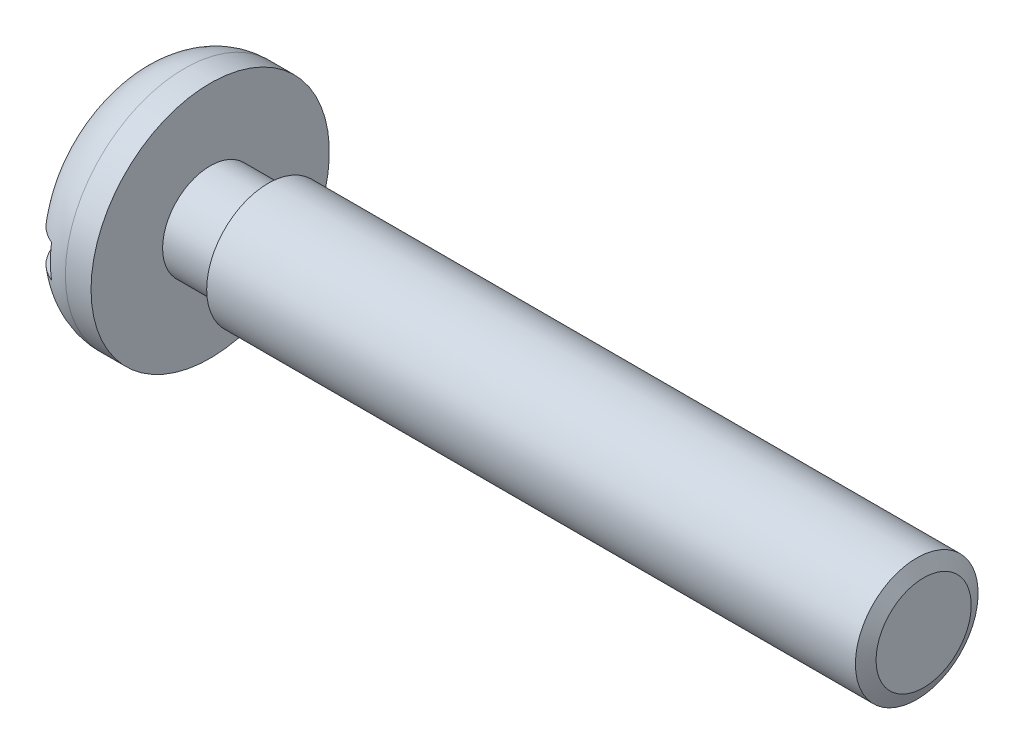
ISO-10303-21;
HEADER;
FILE_DESCRIPTION(('STEP AP214'),'2;1');
FILE_NAME('part.step','',(''),(''),'','','');
FILE_SCHEMA(('AUTOMOTIVE_DESIGN { 1 0 10303 214 1 1 1 1 }'));
ENDSEC;
DATA;
#1=APPLICATION_CONTEXT('core data for automotive mechanical design processes');
#2=APPLICATION_PROTOCOL_DEFINITION('international standard','automotive_design',2000,#1);
#3=PRODUCT_CONTEXT('',#1,'mechanical');
#4=PRODUCT('Part','Part','',(#3));
#5=PRODUCT_RELATED_PRODUCT_CATEGORY('part','',(#4));
#6=PRODUCT_DEFINITION_FORMATION('','',#4);
#7=PRODUCT_DEFINITION_CONTEXT('part definition',#1,'design');
#8=PRODUCT_DEFINITION('design','',#6,#7);
#9=PRODUCT_DEFINITION_SHAPE('','',#8);
#10=(LENGTH_UNIT() NAMED_UNIT(*) SI_UNIT(.MILLI.,.METRE.));
#11=(NAMED_UNIT(*) PLANE_ANGLE_UNIT() SI_UNIT($,.RADIAN.));
#12=(NAMED_UNIT(*) SI_UNIT($,.STERADIAN.) SOLID_ANGLE_UNIT());
#13=UNCERTAINTY_MEASURE_WITH_UNIT(LENGTH_MEASURE(1.E-05),#10,'distance_accuracy_value','');
#14=(GEOMETRIC_REPRESENTATION_CONTEXT(3) GLOBAL_UNCERTAINTY_ASSIGNED_CONTEXT((#13)) GLOBAL_UNIT_ASSIGNED_CONTEXT((#10,
#11,#12)) REPRESENTATION_CONTEXT('',''));
#15=CARTESIAN_POINT('',(0.,0.,0.));
#16=DIRECTION('',(0.,0.,1.));
#17=DIRECTION('',(1.,0.,0.));
#18=AXIS2_PLACEMENT_3D('',#15,#16,#17);
#19=CARTESIAN_POINT('',(-1.3462,1.2319,0.));
#20=DIRECTION('',(1.,0.,0.));
#21=DIRECTION('',(0.,0.,-1.));
#22=AXIS2_PLACEMENT_3D('',#19,#20,#21);
#23=PLANE('',#22);
#24=CARTESIAN_POINT('',(-1.3462,0.,0.));
#25=DIRECTION('',(-1.,0.,0.));
#26=DIRECTION('',(0.,0.,1.));
#27=AXIS2_PLACEMENT_3D('',#24,#25,#26);
#28=CIRCLE('',#27,1.2319);
#29=CARTESIAN_POINT('',(-1.3462,-0.2921,-1.196768649322));
#30=VERTEX_POINT('',#29);
#31=CARTESIAN_POINT('',(-1.3462,-0.2921,1.196768649322));
#32=VERTEX_POINT('',#31);
#33=EDGE_CURVE('E137',#30,#32,#28,.T.);
#34=ORIENTED_EDGE('',*,*,#33,.T.);
#35=DIRECTION('',(0.,0.,-1.));
#36=VECTOR('',#35,1.);
#37=CARTESIAN_POINT('',(-1.3462,-0.2921,0.));
#38=LINE('',#37,#36);
#39=EDGE_CURVE('E138',#32,#30,#38,.T.);
#40=ORIENTED_EDGE('',*,*,#39,.T.);
#41=EDGE_LOOP('',(#34,#40));
#42=FACE_BOUND('',#41,.T.);
#43=ADVANCED_FACE('F15',(#42),#23,.F.);
#44=CARTESIAN_POINT('',(-1.3462,0.2921,1.196768649322));
#45=VERTEX_POINT('',#44);
#46=CARTESIAN_POINT('',(-1.3462,0.2921,-1.196768649322));
#47=VERTEX_POINT('',#46);
#48=EDGE_CURVE('E82',#45,#47,#28,.T.);
#49=ORIENTED_EDGE('',*,*,#48,.T.);
#50=DIRECTION('',(0.,0.,1.));
#51=VECTOR('',#50,1.);
#52=CARTESIAN_POINT('',(-1.3462,0.2921,0.));
#53=LINE('',#52,#51);
#54=EDGE_CURVE('E76',#47,#45,#53,.T.);
#55=ORIENTED_EDGE('',*,*,#54,.T.);
#56=EDGE_LOOP('',(#49,#55));
#57=FACE_BOUND('',#56,.T.);
#58=ADVANCED_FACE('F17',(#57),#23,.F.);
#59=CARTESIAN_POINT('',(12.7,0.,0.));
#60=DIRECTION('',(-1.,0.,0.));
#61=DIRECTION('',(0.,0.,1.));
#62=AXIS2_PLACEMENT_3D('',#59,#60,#61);
#63=PLANE('',#62);
#64=CARTESIAN_POINT('',(12.7,0.,0.));
#65=DIRECTION('',(-1.,0.,0.));
#66=DIRECTION('',(0.,0.,1.));
#67=AXIS2_PLACEMENT_3D('',#64,#65,#66);
#68=CIRCLE('',#67,0.8471);
#69=CARTESIAN_POINT('',(12.7,0.,0.8471));
#70=VERTEX_POINT('',#69);
#71=EDGE_CURVE('E107',#70,#70,#68,.T.);
#72=ORIENTED_EDGE('',*,*,#71,.F.);
#73=EDGE_LOOP('',(#72));
#74=FACE_BOUND('',#73,.T.);
#75=ADVANCED_FACE('F248',(#74),#63,.F.);
#76=CARTESIAN_POINT('',(12.7,0.,0.));
#77=DIRECTION('',(-1.,0.,0.));
#78=DIRECTION('',(0.,0.,1.));
#79=AXIS2_PLACEMENT_3D('',#76,#77,#78);
#80=CONICAL_SURFACE('',#79,0.8471,1.10714871779409);
#81=CARTESIAN_POINT('',(12.57745,0.,0.));
#82=DIRECTION('',(-1.,0.,0.));
#83=DIRECTION('',(0.,0.,1.));
#84=AXIS2_PLACEMENT_3D('',#81,#82,#83);
#85=CIRCLE('',#84,1.0922);
#86=CARTESIAN_POINT('',(12.57745,0.,1.0922));
#87=VERTEX_POINT('',#86);
#88=EDGE_CURVE('E111',#87,#87,#85,.T.);
#89=ORIENTED_EDGE('',*,*,#88,.F.);
#90=EDGE_LOOP('',(#89));
#91=FACE_BOUND('',#90,.T.);
#92=ORIENTED_EDGE('',*,*,#71,.T.);
#93=EDGE_LOOP('',(#92));
#94=FACE_BOUND('',#93,.T.);
#95=ADVANCED_FACE('F237',(#91,#94),#80,.T.);
#96=CARTESIAN_POINT('',(-1.3462,0.,0.));
#97=DIRECTION('',(-1.,0.,0.));
#98=DIRECTION('',(0.,0.,1.));
#99=AXIS2_PLACEMENT_3D('',#96,#97,#98);
#100=CYLINDRICAL_SURFACE('',#99,1.0922);
#101=CARTESIAN_POINT('',(1.02969285714286,0.,0.));
#102=DIRECTION('',(-1.,0.,0.));
#103=DIRECTION('',(0.,0.,1.));
#104=AXIS2_PLACEMENT_3D('',#101,#102,#103);
#105=CIRCLE('',#104,1.0922);
#106=CARTESIAN_POINT('',(1.02969285714286,0.,1.0922));
#107=VERTEX_POINT('',#106);
#108=EDGE_CURVE('E115',#107,#107,#105,.T.);
#109=ORIENTED_EDGE('',*,*,#108,.F.);
#110=EDGE_LOOP('',(#109));
#111=FACE_BOUND('',#110,.T.);
#112=ORIENTED_EDGE('',*,*,#88,.T.);
#113=EDGE_LOOP('',(#112));
#114=FACE_BOUND('',#113,.T.);
#115=ADVANCED_FACE('F226',(#111,#114),#100,.T.);
#116=CARTESIAN_POINT('',(1.02969285714286,0.,0.));
#117=DIRECTION('',(1.,0.,0.));
#118=DIRECTION('',(0.,0.,-1.));
#119=AXIS2_PLACEMENT_3D('',#116,#117,#118);
#120=CONICAL_SURFACE('',#119,1.0922,1.10714871779409);
#121=CARTESIAN_POINT('',(0.907142857142857,0.,0.));
#122=DIRECTION('',(-1.,0.,0.));
#123=DIRECTION('',(0.,0.,1.));
#124=AXIS2_PLACEMENT_3D('',#121,#122,#123);
#125=CIRCLE('',#124,0.8471);
#126=CARTESIAN_POINT('',(0.907142857142857,0.,0.8471));
#127=VERTEX_POINT('',#126);
#128=EDGE_CURVE('E119',#127,#127,#125,.T.);
#129=ORIENTED_EDGE('',*,*,#128,.F.);
#130=EDGE_LOOP('',(#129));
#131=FACE_BOUND('',#130,.T.);
#132=ORIENTED_EDGE('',*,*,#108,.T.);
#133=EDGE_LOOP('',(#132));
#134=FACE_BOUND('',#133,.T.);
#135=ADVANCED_FACE('F215',(#131,#134),#120,.T.);
#136=CARTESIAN_POINT('',(-1.3462,0.,0.));
#137=DIRECTION('',(-1.,0.,0.));
#138=DIRECTION('',(0.,0.,1.));
#139=AXIS2_PLACEMENT_3D('',#136,#137,#138);
#140=CYLINDRICAL_SURFACE('',#139,0.8471);
#141=CARTESIAN_POINT('',(0.,0.,0.));
#142=DIRECTION('',(-1.,0.,0.));
#143=DIRECTION('',(0.,0.,1.));
#144=AXIS2_PLACEMENT_3D('',#141,#142,#143);
#145=CIRCLE('',#144,0.8471);
#146=CARTESIAN_POINT('',(0.,0.,0.8471));
#147=VERTEX_POINT('',#146);
#148=EDGE_CURVE('E123',#147,#147,#145,.T.);
#149=ORIENTED_EDGE('',*,*,#148,.F.);
#150=EDGE_LOOP('',(#149));
#151=FACE_BOUND('',#150,.T.);
#152=ORIENTED_EDGE('',*,*,#128,.T.);
#153=EDGE_LOOP('',(#152));
#154=FACE_BOUND('',#153,.T.);
#155=ADVANCED_FACE('F204',(#151,#154),#140,.T.);
#156=CARTESIAN_POINT('',(0.,0.8471,0.));
#157=DIRECTION('',(-1.,0.,0.));
#158=DIRECTION('',(0.,0.,1.));
#159=AXIS2_PLACEMENT_3D('',#156,#157,#158);
#160=PLANE('',#159);
#161=CARTESIAN_POINT('',(0.,0.,0.));
#162=DIRECTION('',(-1.,0.,0.));
#163=DIRECTION('',(0.,0.,1.));
#164=AXIS2_PLACEMENT_3D('',#161,#162,#163);
#165=CIRCLE('',#164,2.1209);
#166=CARTESIAN_POINT('',(0.,0.,2.1209));
#167=VERTEX_POINT('',#166);
#168=EDGE_CURVE('E127',#167,#167,#165,.T.);
#169=ORIENTED_EDGE('',*,*,#168,.F.);
#170=EDGE_LOOP('',(#169));
#171=FACE_BOUND('',#170,.T.);
#172=ORIENTED_EDGE('',*,*,#148,.T.);
#173=EDGE_LOOP('',(#172));
#174=FACE_BOUND('',#173,.T.);
#175=ADVANCED_FACE('F194',(#171,#174),#160,.F.);
#176=CARTESIAN_POINT('',(-1.3462,0.,0.));
#177=DIRECTION('',(-1.,0.,0.));
#178=DIRECTION('',(0.,0.,1.));
#179=AXIS2_PLACEMENT_3D('',#176,#177,#178);
#180=CYLINDRICAL_SURFACE('',#179,2.1209);
#181=CARTESIAN_POINT('',(-0.4572,0.,0.));
#182=DIRECTION('',(-1.,0.,0.));
#183=DIRECTION('',(0.,0.,1.));
#184=AXIS2_PLACEMENT_3D('',#181,#182,#183);
#185=CIRCLE('',#184,2.1209);
#186=CARTESIAN_POINT('',(-0.4572,0.,2.1209));
#187=VERTEX_POINT('',#186);
#188=EDGE_CURVE('E131',#187,#187,#185,.T.);
#189=ORIENTED_EDGE('',*,*,#188,.F.);
#190=EDGE_LOOP('',(#189));
#191=FACE_BOUND('',#190,.T.);
#192=ORIENTED_EDGE('',*,*,#168,.T.);
#193=EDGE_LOOP('',(#192));
#194=FACE_BOUND('',#193,.T.);
#195=ADVANCED_FACE('F185',(#191,#194),#180,.T.);
#196=CARTESIAN_POINT('',(-0.4572,0.,0.));
#197=DIRECTION('',(-1.,0.,0.));
#198=DIRECTION('',(0.,0.,1.));
#199=AXIS2_PLACEMENT_3D('',#196,#197,#198);
#200=TOROIDAL_SURFACE('',#199,1.2319,0.889);
#201=CARTESIAN_POINT('',(-0.7874,0.,0.));
#202=DIRECTION('',(1.,0.,0.));
#203=DIRECTION('',(0.,0.,-1.));
#204=AXIS2_PLACEMENT_3D('',#201,#202,#203);
#205=CIRCLE('',#204,2.05730230191102);
#206=CARTESIAN_POINT('',(-0.7874,0.2921,2.03646025039733));
#207=VERTEX_POINT('',#206);
#208=CARTESIAN_POINT('',(-0.7874,-0.2921,2.03646025039733));
#209=VERTEX_POINT('',#208);
#210=EDGE_CURVE('E61',#207,#209,#205,.T.);
#211=ORIENTED_EDGE('',*,*,#210,.T.);
#212=CARTESIAN_POINT('',(-0.992672438637413,-0.2921,0.432934305643319));
#213=CARTESIAN_POINT('',(-0.951976302403638,-0.2921,0.395882314610575));
#214=CARTESIAN_POINT('',(-0.908727308114687,-0.2921,0.361624142766205));
#215=CARTESIAN_POINT('',(-0.840630830973308,-0.2921,0.314956422780139));
#216=CARTESIAN_POINT('',(-0.817376844307591,-0.2921,0.300178124351799));
#217=CARTESIAN_POINT('',(-0.769830336334795,-0.2921,0.272408816585435));
#218=CARTESIAN_POINT('',(-0.745538319363267,-0.2921,0.259416951949301));
#219=CARTESIAN_POINT('',(-0.691476053082714,-0.2921,0.233453302492282));
#220=CARTESIAN_POINT('',(-0.661501470432795,-0.2921,0.22089837012876));
#221=CARTESIAN_POINT('',(-0.600181210266825,-0.2921,0.200024753087824));
#222=CARTESIAN_POINT('',(-0.568842288590604,-0.2921,0.191687312499439));
#223=CARTESIAN_POINT('',(-0.509599457312778,-0.2921,0.181785972508896));
#224=CARTESIAN_POINT('',(-0.481836724849506,-0.2921,0.179430749928932));
#225=CARTESIAN_POINT('',(-0.426342853074537,-0.2921,0.179800268752367));
#226=CARTESIAN_POINT('',(-0.398611722176877,-0.2921,0.182526141735702));
#227=CARTESIAN_POINT('',(-0.334096578427921,-0.2921,0.194097869512075));
#228=CARTESIAN_POINT('',(-0.297666095143047,-0.2921,0.20480069646197));
#229=CARTESIAN_POINT('',(-0.226665266455918,-0.2921,0.231455710401772));
#230=CARTESIAN_POINT('',(-0.192108063254158,-0.2921,0.247440493728884));
#231=CARTESIAN_POINT('',(-0.129893014009047,-0.2921,0.280465132785374));
#232=CARTESIAN_POINT('',(-0.101966495091048,-0.2921,0.297006626603626));
#233=CARTESIAN_POINT('',(-0.0475848363779582,-0.2921,0.332362694096872));
#234=CARTESIAN_POINT('',(-0.021130508844512,-0.2921,0.351178504787953));
#235=CARTESIAN_POINT('',(0.0557498887027582,-0.2921,0.410647327942976));
#236=CARTESIAN_POINT('',(0.103837699645755,-0.2921,0.45440039799162));
#237=CARTESIAN_POINT('',(0.19267941328707,-0.2921,0.54994205808474));
#238=CARTESIAN_POINT('',(0.233325092281033,-0.2921,0.601831512275902));
#239=CARTESIAN_POINT('',(0.30452091587593,-0.2921,0.712152698523906));
#240=CARTESIAN_POINT('',(0.335078076750835,-0.2921,0.770579845778615));
#241=CARTESIAN_POINT('',(0.382651320036513,-0.2921,0.888038597832505));
#242=CARTESIAN_POINT('',(0.400457200702972,-0.2921,0.946749442702547));
#243=CARTESIAN_POINT('',(0.424745459936411,-0.2921,1.06648802241002));
#244=CARTESIAN_POINT('',(0.431231788575531,-0.2921,1.12751494143121));
#245=CARTESIAN_POINT('',(0.432243697825684,-0.2921,1.24352816725672));
#246=CARTESIAN_POINT('',(0.427904016121639,-0.2921,1.29850622045822));
#247=CARTESIAN_POINT('',(0.409535255455774,-0.2921,1.40681520034198));
#248=CARTESIAN_POINT('',(0.395510450915781,-0.2921,1.46014684280614));
#249=CARTESIAN_POINT('',(0.359061437997411,-0.2921,1.56072841183747));
#250=CARTESIAN_POINT('',(0.337110558223342,-0.2921,1.60815030380737));
#251=CARTESIAN_POINT('',(0.285352482255086,-0.2921,1.69849554453694));
#252=CARTESIAN_POINT('',(0.255546454905018,-0.2921,1.74141956125242));
#253=CARTESIAN_POINT('',(0.189795813324276,-0.2921,1.82038320852261));
#254=CARTESIAN_POINT('',(0.154031761032469,-0.2921,1.85657330582249));
#255=CARTESIAN_POINT('',(0.0768609189134639,-0.2921,1.92233195432511));
#256=CARTESIAN_POINT('',(0.0354546294751286,-0.2921,1.95190109210192));
#257=CARTESIAN_POINT('',(-0.051199372290232,-0.2921,2.00316417171778));
#258=CARTESIAN_POINT('',(-0.0963859756334818,-0.2921,2.02496146011344));
#259=CARTESIAN_POINT('',(-0.189794863444509,-0.2921,2.06059947774309));
#260=CARTESIAN_POINT('',(-0.238017013247673,-0.2921,2.07444055965917));
#261=CARTESIAN_POINT('',(-0.335764668045911,-0.2921,2.09368641852875));
#262=CARTESIAN_POINT('',(-0.385278691349902,-0.2921,2.09914955190282));
#263=CARTESIAN_POINT('',(-0.484519453606647,-0.2921,2.10166360796056));
#264=CARTESIAN_POINT('',(-0.534246188283067,-0.2921,2.09871469897306));
#265=CARTESIAN_POINT('',(-0.632375738931346,-0.2921,2.0845089698509));
#266=CARTESIAN_POINT('',(-0.680781443517738,-0.2921,2.07327208755944));
#267=CARTESIAN_POINT('',(-0.77502314738635,-0.2921,2.04284266210274));
#268=CARTESIAN_POINT('',(-0.820859151169377,-0.2921,2.02365013287223));
#269=CARTESIAN_POINT('',(-0.908739661466676,-0.2921,1.97783533101026));
#270=CARTESIAN_POINT('',(-0.950778430758976,-0.2921,1.9512020567031));
#271=CARTESIAN_POINT('',(-1.02981938083941,-0.2921,1.89129319939671));
#272=CARTESIAN_POINT('',(-1.06682148964855,-0.2921,1.85801752148754));
#273=CARTESIAN_POINT('',(-1.13497797888147,-0.2921,1.78557604040786));
#274=CARTESIAN_POINT('',(-1.16609763403501,-0.2921,1.74637757680937));
#275=CARTESIAN_POINT('',(-1.22139984472465,-0.2921,1.66336245659058));
#276=CARTESIAN_POINT('',(-1.2455821264248,-0.2921,1.61954561776446));
#277=CARTESIAN_POINT('',(-1.28664519432551,-0.2921,1.52800704096665));
#278=CARTESIAN_POINT('',(-1.30343834606938,-0.2921,1.48024601864444));
#279=CARTESIAN_POINT('',(-1.32894363580326,-0.2921,1.38261880771803));
#280=CARTESIAN_POINT('',(-1.33765541348183,-0.2921,1.33275252535354));
#281=CARTESIAN_POINT('',(-1.34698928328245,-0.2921,1.23122253976434));
#282=CARTESIAN_POINT('',(-1.34743873377999,-0.2921,1.17954304448759));
#283=CARTESIAN_POINT('',(-1.33997550050584,-0.2921,1.0767962437406));
#284=CARTESIAN_POINT('',(-1.33206131228534,-0.2921,1.02572905008238));
#285=CARTESIAN_POINT('',(-1.30785496246849,-0.2921,0.923599249518503));
#286=CARTESIAN_POINT('',(-1.29125928355239,-0.2921,0.872608860886494));
#287=CARTESIAN_POINT('',(-1.25027871991642,-0.2921,0.773888674672268));
#288=CARTESIAN_POINT('',(-1.22589419258904,-0.2921,0.726158727606152));
#289=CARTESIAN_POINT('',(-1.17009543264154,-0.2921,0.634594296147874));
#290=CARTESIAN_POINT('',(-1.13863614956343,-0.2921,0.590787409837325));
#291=CARTESIAN_POINT('',(-1.06982489913658,-0.2921,0.508072521804637));
#292=CARTESIAN_POINT('',(-1.03246931055133,-0.2921,0.469167557193672));
#293=CARTESIAN_POINT('',(-0.992672438637413,-0.2921,0.432934305643319));
#294=B_SPLINE_CURVE_WITH_KNOTS('',3,(#212,#213,#214,#215,#216,#217,#218,#219,#220,#221,#222,
#223,#224,#225,#226,#227,#228,#229,#230,#231,#232,#233,#234,#235,#236,#237,#238,#239,#240,#241,
#242,#243,#244,#245,#246,#247,#248,#249,#250,#251,#252,#253,#254,#255,#256,#257,#258,#259,#260,
#261,#262,#263,#264,#265,#266,#267,#268,#269,#270,#271,#272,#273,#274,#275,#276,#277,#278,#279,
#280,#281,#282,#283,#284,#285,#286,#287,#288,#289,#290,#291,#292,#293),.UNSPECIFIED.,.T.,.F.,(4,
2,2,2,2,2,2,2,2,2,2,2,2,2,2,2,2,2,2,2,2,2,2,2,2,2,2,2,2,2,2,2,2,2,2,2,2,2,2,2,4),(0.,
0.16495775981017,0.24755626720245,0.330115089844927,0.427398573052825,0.524245530215674,
0.60739299954584,0.69055898835636,0.803805959361426,0.91776528282531,1.01501518531125,
1.11231822271878,1.30643675482596,1.50318604715208,1.69979821634306,1.88282418140949,
2.06578626493389,2.23039162657576,2.39492438785135,2.55092420669776,2.70690082590108,
2.8588056311825,3.01069697335346,3.16048575872783,3.31026790376476,3.45900192815745,
3.60773297633499,3.75610739400144,3.90448155178353,4.05307626315311,4.20167309786912,
4.3511214611586,4.50057572274764,4.65175763003305,4.80294627750292,4.95729050769183,
5.11166250600081,5.27183282781698,5.43199580124925,5.59320908443223,5.75452176533789),.UNSPECIFIED.);
#295=EDGE_CURVE('E10',#209,#32,#294,.T.);
#296=ORIENTED_EDGE('',*,*,#295,.T.);
#297=ORIENTED_EDGE('',*,*,#33,.F.);
#298=CARTESIAN_POINT('',(-1.06697298726154,-0.2921,-1.85596879314736));
#299=CARTESIAN_POINT('',(-1.03098548144302,-0.2921,-1.89030721062701));
#300=CARTESIAN_POINT('',(-0.992107884086906,-0.2921,-1.9216253737167));
#301=CARTESIAN_POINT('',(-0.909644399354977,-0.2921,-1.97730508815571));
#302=CARTESIAN_POINT('',(-0.866057577568001,-0.2921,-2.00166525538257));
#303=CARTESIAN_POINT('',(-0.775399479777941,-0.2921,-2.04271054069887));
#304=CARTESIAN_POINT('',(-0.728327719279927,-0.2921,-2.05939458927808));
#305=CARTESIAN_POINT('',(-0.632046826721519,-0.2921,-2.08458876370733));
#306=CARTESIAN_POINT('',(-0.582837789836314,-0.2921,-2.09309925314537));
#307=CARTESIAN_POINT('',(-0.483872766325003,-0.2921,-2.10168005939517));
#308=CARTESIAN_POINT('',(-0.43411946886111,-0.2921,-2.10178141268704));
#309=CARTESIAN_POINT('',(-0.335304317498453,-0.2921,-2.09361914516227));
#310=CARTESIAN_POINT('',(-0.286242456640679,-0.2921,-2.08535560859567));
#311=CARTESIAN_POINT('',(-0.190258784568471,-0.2921,-2.06072057304478));
#312=CARTESIAN_POINT('',(-0.143334606238082,-0.2921,-2.04435829270059));
#313=CARTESIAN_POINT('',(-0.0528890535515041,-0.2921,-2.00400875494042));
#314=CARTESIAN_POINT('',(-0.00936769366654838,-0.2921,-1.98002146509961));
#315=CARTESIAN_POINT('',(0.0731727925832212,-0.2921,-1.9250437981044));
#316=CARTESIAN_POINT('',(0.112179208450556,-0.2921,-1.89403434353768));
#317=CARTESIAN_POINT('',(0.184477690524985,-0.2921,-1.82595030639236));
#318=CARTESIAN_POINT('',(0.217769648109022,-0.2921,-1.78887560854899));
#319=CARTESIAN_POINT('',(0.277970868440114,-0.2921,-1.70943388883647));
#320=CARTESIAN_POINT('',(0.304831471891644,-0.2921,-1.66703000719749));
#321=CARTESIAN_POINT('',(0.351162133369711,-0.2921,-1.57836386916823));
#322=CARTESIAN_POINT('',(0.37063182752706,-0.2921,-1.53210142294986));
#323=CARTESIAN_POINT('',(0.401948275669985,-0.2921,-1.43634785180313));
#324=CARTESIAN_POINT('',(0.413684268389264,-0.2921,-1.38682053982095));
#325=CARTESIAN_POINT('',(0.428889824774922,-0.2921,-1.28651981559142));
#326=CARTESIAN_POINT('',(0.432358956784081,-0.2921,-1.23574633841493));
#327=CARTESIAN_POINT('',(0.431078862405955,-0.2921,-1.13303224849355));
#328=CARTESIAN_POINT('',(0.426121042227419,-0.2921,-1.08109434943144));
#329=CARTESIAN_POINT('',(0.407936632360012,-0.2921,-0.978693150561658));
#330=CARTESIAN_POINT('',(0.394708332033858,-0.2921,-0.928230158079346));
#331=CARTESIAN_POINT('',(0.359808634821553,-0.2921,-0.827747809325714));
#332=CARTESIAN_POINT('',(0.337781453922837,-0.2921,-0.777852421282294));
#333=CARTESIAN_POINT('',(0.286279522453327,-0.2921,-0.682098190054024));
#334=CARTESIAN_POINT('',(0.256804592194011,-0.2921,-0.636239444295439));
#335=CARTESIAN_POINT('',(0.188793411919309,-0.2921,-0.545776261529059));
#336=CARTESIAN_POINT('',(0.149712472283708,-0.2921,-0.50158272253969));
#337=CARTESIAN_POINT('',(0.0654029337913393,-0.2921,-0.41943681508496));
#338=CARTESIAN_POINT('',(0.0201666005199633,-0.2921,-0.38149243359891));
#339=CARTESIAN_POINT('',(-0.0655144480877994,-0.2921,-0.319656520268563));
#340=CARTESIAN_POINT('',(-0.105030774172858,-0.2921,-0.294479834363365));
#341=CARTESIAN_POINT('',(-0.166517885754436,-0.2921,-0.260777339308461));
#342=CARTESIAN_POINT('',(-0.187380638483858,-0.2921,-0.250220931364947));
#343=CARTESIAN_POINT('',(-0.22985543169453,-0.2921,-0.230757236114179));
#344=CARTESIAN_POINT('',(-0.251467077599952,-0.2921,-0.221849095595576));
#345=CARTESIAN_POINT('',(-0.30141375983301,-0.2921,-0.203993981505409));
#346=CARTESIAN_POINT('',(-0.329988040695985,-0.2921,-0.195686487556193));
#347=CARTESIAN_POINT('',(-0.388020025038903,-0.2921,-0.183882848722512));
#348=CARTESIAN_POINT('',(-0.417471947697693,-0.2921,-0.180360265915577));
#349=CARTESIAN_POINT('',(-0.476684100732781,-0.2921,-0.179069970047914));
#350=CARTESIAN_POINT('',(-0.506445129601433,-0.2921,-0.181335562051191));
#351=CARTESIAN_POINT('',(-0.565212057501611,-0.2921,-0.191005491205652));
#352=CARTESIAN_POINT('',(-0.594213100956741,-0.2921,-0.198437083159847));
#353=CARTESIAN_POINT('',(-0.645881942505189,-0.2921,-0.215317364373907));
#354=CARTESIAN_POINT('',(-0.668755620572376,-0.2921,-0.224168557723448));
#355=CARTESIAN_POINT('',(-0.713679278072415,-0.2921,-0.243778326687423));
#356=CARTESIAN_POINT('',(-0.735728656526258,-0.2921,-0.254538262309401));
#357=CARTESIAN_POINT('',(-0.800727778021493,-0.2921,-0.289148454517574));
#358=CARTESIAN_POINT('',(-0.842453164995195,-0.2921,-0.315301690704514));
#359=CARTESIAN_POINT('',(-0.936436817387702,-0.2921,-0.382491279483391));
#360=CARTESIAN_POINT('',(-0.987265338494482,-0.2921,-0.425532053164752));
#361=CARTESIAN_POINT('',(-1.08091844661583,-0.2921,-0.519471660579893));
#362=CARTESIAN_POINT('',(-1.12375749870863,-0.2921,-0.570355982126777));
#363=CARTESIAN_POINT('',(-1.1993519535428,-0.2921,-0.678768612122051));
#364=CARTESIAN_POINT('',(-1.23216234462503,-0.2921,-0.736258221148343));
#365=CARTESIAN_POINT('',(-1.2861633281036,-0.2921,-0.856512120051585));
#366=CARTESIAN_POINT('',(-1.30735531410856,-0.2921,-0.919275776273221));
#367=CARTESIAN_POINT('',(-1.33494887975992,-0.2921,-1.04014019393372));
#368=CARTESIAN_POINT('',(-1.3428076709284,-0.2921,-1.09790993294163));
#369=CARTESIAN_POINT('',(-1.34782264907081,-0.2921,-1.21390959589146));
#370=CARTESIAN_POINT('',(-1.34498520279187,-0.2921,-1.27213922549821));
#371=CARTESIAN_POINT('',(-1.3291314528051,-0.2921,-1.38250251927555));
#372=CARTESIAN_POINT('',(-1.31693458217976,-0.2921,-1.43475505322979));
#373=CARTESIAN_POINT('',(-1.28358835438538,-0.2921,-1.53631137202184));
#374=CARTESIAN_POINT('',(-1.26244379484754,-0.2921,-1.58561672095573));
#375=CARTESIAN_POINT('',(-1.21483378384803,-0.2921,-1.67403025523813));
#376=CARTESIAN_POINT('',(-1.18931514441613,-0.2921,-1.71365149524175));
#377=CARTESIAN_POINT('',(-1.13238106226083,-0.2921,-1.78840264887311));
#378=CARTESIAN_POINT('',(-1.10096636246282,-0.2921,-1.82353312741687));
#379=CARTESIAN_POINT('',(-1.06697298726154,-0.2921,-1.85596879314736));
#380=B_SPLINE_CURVE_WITH_KNOTS('',3,(#298,#299,#300,#301,#302,#303,#304,#305,#306,#307,#308,
#309,#310,#311,#312,#313,#314,#315,#316,#317,#318,#319,#320,#321,#322,#323,#324,#325,#326,#327,
#328,#329,#330,#331,#332,#333,#334,#335,#336,#337,#338,#339,#340,#341,#342,#343,#344,#345,#346,
#347,#348,#349,#350,#351,#352,#353,#354,#355,#356,#357,#358,#359,#360,#361,#362,#363,#364,#365,
#366,#367,#368,#369,#370,#371,#372,#373,#374,#375,#376,#377,#378,#379),.UNSPECIFIED.,.T.,.F.,(4,
2,2,2,2,2,2,2,2,2,2,2,2,2,2,2,2,2,2,2,2,2,2,2,2,2,2,2,2,2,2,2,2,2,2,2,2,2,2,2,4),(0.,
0.14905902386792,0.298147678751285,0.447257099805331,0.596359887652682,0.744912341640851,
0.89346329944394,1.04184555215146,1.19022843585283,1.33901937952592,1.48781315117269,
1.63769943053109,1.78759308813289,1.93958936812845,2.09159358449268,2.24741541426667,
2.40326948435204,2.56619358506477,2.72912161694988,2.90540399980085,3.08190996752683,
3.22210912823777,3.2921977247132,3.36224993830917,3.451224485425,3.53970539675627,
3.62869657101617,3.71816084426597,3.79164316554849,3.86517805593972,4.01248592577054,
4.21139011458747,4.40993061153603,4.60736210675416,4.80476991520433,4.97874179997717,
5.15261014740244,5.31278224788245,5.47286857482533,5.61368570915038,5.75448511189392),.UNSPECIFIED.);
#381=CARTESIAN_POINT('',(-0.7874,-0.2921,-2.03646025039733));
#382=VERTEX_POINT('',#381);
#383=EDGE_CURVE('E43',#30,#382,#380,.T.);
#384=ORIENTED_EDGE('',*,*,#383,.T.);
#385=CARTESIAN_POINT('',(-0.7874,0.2921,-2.03646025039733));
#386=VERTEX_POINT('',#385);
#387=EDGE_CURVE('E68',#382,#386,#205,.T.);
#388=ORIENTED_EDGE('',*,*,#387,.T.);
#389=CARTESIAN_POINT('',(-1.06697298726154,0.2921,-1.85596879314736));
#390=CARTESIAN_POINT('',(-1.10354708191385,0.2921,-1.8210667472002));
#391=CARTESIAN_POINT('',(-1.13716869677334,0.2921,-1.78301322630452));
#392=CARTESIAN_POINT('',(-1.19753583165128,0.2921,-1.70174544545054));
#393=CARTESIAN_POINT('',(-1.22427214476066,0.2921,-1.65852438740261));
#394=CARTESIAN_POINT('',(-1.27010367740325,0.2921,-1.56826934336279));
#395=CARTESIAN_POINT('',(-1.28920801116125,0.2921,-1.52123998654877));
#396=CARTESIAN_POINT('',(-1.31936631369945,0.2921,-1.42469028143375));
#397=CARTESIAN_POINT('',(-1.33042258060802,0.2921,-1.37517064855333));
#398=CARTESIAN_POINT('',(-1.3444171370963,0.2921,-1.27425757644573));
#399=CARTESIAN_POINT('',(-1.34723340776844,0.2921,-1.22284727839722));
#400=CARTESIAN_POINT('',(-1.34449205791633,0.2921,-1.12025065901046));
#401=CARTESIAN_POINT('',(-1.3389323687076,0.2921,-1.06906439613576));
#402=CARTESIAN_POINT('',(-1.31946016188711,0.2921,-0.966473499845394));
#403=CARTESIAN_POINT('',(-1.30526492171769,0.2921,-0.915122743630748));
#404=CARTESIAN_POINT('',(-1.2689597835808,0.2921,-0.815335009058525));
#405=CARTESIAN_POINT('',(-1.24685117327621,0.2921,-0.766897558145079));
#406=CARTESIAN_POINT('',(-1.1939911224401,0.2921,-0.67101952646385));
#407=CARTESIAN_POINT('',(-1.16278700313543,0.2921,-0.623829098727242));
#408=CARTESIAN_POINT('',(-1.09360263837529,0.2921,-0.534667399266872));
#409=CARTESIAN_POINT('',(-1.05561334737469,0.2921,-0.492703223174028));
#410=CARTESIAN_POINT('',(-0.969581240619593,0.2921,-0.410267090352194));
#411=CARTESIAN_POINT('',(-0.920892646937336,0.2921,-0.370464284514564));
#412=CARTESIAN_POINT('',(-0.843677993687896,0.2921,-0.316835843256897));
#413=CARTESIAN_POINT('',(-0.817219651673264,0.2921,-0.299961108071455));
#414=CARTESIAN_POINT('',(-0.762963103697467,0.2921,-0.268540844362752));
#415=CARTESIAN_POINT('',(-0.735165994716016,0.2921,-0.253993449692668));
#416=CARTESIAN_POINT('',(-0.677570247336987,0.2921,-0.227522190381186));
#417=CARTESIAN_POINT('',(-0.647740831184659,0.2921,-0.215663922683793));
#418=CARTESIAN_POINT('',(-0.586816178107002,0.2921,-0.196329123679199));
#419=CARTESIAN_POINT('',(-0.555729797897136,0.2921,-0.188826239385564));
#420=CARTESIAN_POINT('',(-0.492099654757595,0.2921,-0.179866088840567));
#421=CARTESIAN_POINT('',(-0.459540534988772,0.2921,-0.178507430150808));
#422=CARTESIAN_POINT('',(-0.394805687860516,0.2921,-0.18263583016526));
#423=CARTESIAN_POINT('',(-0.362631540001973,0.2921,-0.188145031534325));
#424=CARTESIAN_POINT('',(-0.289499772419427,0.2921,-0.20687927202918));
#425=CARTESIAN_POINT('',(-0.249070384282891,0.2921,-0.22202472634886));
#426=CARTESIAN_POINT('',(-0.170637726489418,0.2921,-0.257823025914493));
#427=CARTESIAN_POINT('',(-0.132647305203846,0.2921,-0.27850247413932));
#428=CARTESIAN_POINT('',(-0.0675149535839641,0.2921,-0.31886513611093));
#429=CARTESIAN_POINT('',(-0.0398569105660963,0.2921,-0.337723568663297));
#430=CARTESIAN_POINT('',(0.0137983112234526,0.2921,-0.377676168452173));
#431=CARTESIAN_POINT('',(0.0397948540346582,0.2921,-0.398771183651823));
#432=CARTESIAN_POINT('',(0.114893648233122,0.2921,-0.4650991006688));
#433=CARTESIAN_POINT('',(0.161287853246664,0.2921,-0.513488904302052));
#434=CARTESIAN_POINT('',(0.244603002868148,0.2921,-0.617493032025491));
#435=CARTESIAN_POINT('',(0.281565588738332,0.2921,-0.673073907263759));
#436=CARTESIAN_POINT('',(0.344323119589687,0.2921,-0.79028222891346));
#437=CARTESIAN_POINT('',(0.370120497043002,0.2921,-0.851908354703502));
#438=CARTESIAN_POINT('',(0.406821920435411,0.2921,-0.972278101098645));
#439=CARTESIAN_POINT('',(0.419021537327799,0.2921,-1.03062751120777));
#440=CARTESIAN_POINT('',(0.432411449928743,0.2921,-1.14857654095137));
#441=CARTESIAN_POINT('',(0.433608397243461,0.2921,-1.20817538340048));
#442=CARTESIAN_POINT('',(0.425076733491273,0.2921,-1.32124494827329));
#443=CARTESIAN_POINT('',(0.416309639352548,0.2921,-1.37478956577665));
#444=CARTESIAN_POINT('',(0.38949018281249,0.2921,-1.47950114415257));
#445=CARTESIAN_POINT('',(0.371440696282024,0.2921,-1.53066883609386));
#446=CARTESIAN_POINT('',(0.327506306053366,0.2921,-1.62680340605762));
#447=CARTESIAN_POINT('',(0.302000858102529,0.2921,-1.67194401480272));
#448=CARTESIAN_POINT('',(0.243608134125021,0.2921,-1.75716890252439));
#449=CARTESIAN_POINT('',(0.210721868863854,0.2921,-1.7972538726721));
#450=CARTESIAN_POINT('',(0.13932252759408,0.2921,-1.870295555313));
#451=CARTESIAN_POINT('',(0.100952569515406,0.2921,-1.90339226018181));
#452=CARTESIAN_POINT('',(0.0191439931503264,0.2921,-1.96258061041663));
#453=CARTESIAN_POINT('',(-0.0242942576031772,0.2921,-1.98867276327318));
#454=CARTESIAN_POINT('',(-0.114442985584297,0.2921,-2.03280024919016));
#455=CARTESIAN_POINT('',(-0.161108306044845,0.2921,-2.05092787741118));
#456=CARTESIAN_POINT('',(-0.256828616574534,0.2921,-2.07903907989231));
#457=CARTESIAN_POINT('',(-0.305883420499071,0.2921,-2.08902328746617));
#458=CARTESIAN_POINT('',(-0.404680863880405,0.2921,-2.10051885060317));
#459=CARTESIAN_POINT('',(-0.454417728990386,0.2921,-2.10207990462215));
#460=CARTESIAN_POINT('',(-0.553459025209268,0.2921,-2.09681555488842));
#461=CARTESIAN_POINT('',(-0.602763350540307,0.2921,-2.08998815431135));
#462=CARTESIAN_POINT('',(-0.699470778389757,0.2921,-2.06815921131793));
#463=CARTESIAN_POINT('',(-0.746875711137688,0.2921,-2.05316575138903));
#464=CARTESIAN_POINT('',(-0.838460214594292,0.2921,-2.01545719792333));
#465=CARTESIAN_POINT('',(-0.882643669031893,0.2921,-1.99275159536316));
#466=CARTESIAN_POINT('',(-0.950126224020824,0.2921,-1.95058947004561));
#467=CARTESIAN_POINT('',(-0.974831566965626,0.2921,-1.93333882922593));
#468=CARTESIAN_POINT('',(-1.0223646257502,0.2921,-1.89642093639501));
#469=CARTESIAN_POINT('',(-1.04519234789128,0.2921,-1.87675369249446));
#470=CARTESIAN_POINT('',(-1.06697298726154,0.2921,-1.85596879314736));
#471=B_SPLINE_CURVE_WITH_KNOTS('',3,(#389,#390,#391,#392,#393,#394,#395,#396,#397,#398,#399,
#400,#401,#402,#403,#404,#405,#406,#407,#408,#409,#410,#411,#412,#413,#414,#415,#416,#417,#418,
#419,#420,#421,#422,#423,#424,#425,#426,#427,#428,#429,#430,#431,#432,#433,#434,#435,#436,#437,
#438,#439,#440,#441,#442,#443,#444,#445,#446,#447,#448,#449,#450,#451,#452,#453,#454,#455,#456,
#457,#458,#459,#460,#461,#462,#463,#464,#465,#466,#467,#468,#469,#470),.UNSPECIFIED.,.T.,.F.,(4,
2,2,2,2,2,2,2,2,2,2,2,2,2,2,2,2,2,2,2,2,2,2,2,2,2,2,2,2,2,2,2,2,2,2,2,2,2,2,2,4),(0.,
0.151553294671669,0.303308203737549,0.454881339128215,0.606411175758905,0.760173804038181,
0.913974414652259,1.07310367866105,1.23220706093292,1.40122367501286,1.57046731601042,
1.75828416091654,1.85234530689232,1.94633064903589,2.04240778370168,2.13789735935502,
2.2349141139832,2.33224447083601,2.46108211725033,2.59055059706016,2.69085695205165,
2.79120147344967,2.9912519185574,3.19040321748087,3.38951110708164,3.56737094438813,
3.74512325038649,3.90707844517397,4.06898349320366,4.22376895284519,4.37853322832289,
4.52981822565385,4.68109225919464,4.83056381413552,4.98002374356625,5.12860085443755,
5.27721334010655,5.4256790008002,5.57396260972703,5.66421607372687,5.75446923482352),.UNSPECIFIED.);
#472=EDGE_CURVE('E73',#386,#47,#471,.T.);
#473=ORIENTED_EDGE('',*,*,#472,.T.);
#474=ORIENTED_EDGE('',*,*,#48,.F.);
#475=CARTESIAN_POINT('',(-0.992672438637413,0.2921,0.432934305643319));
#476=CARTESIAN_POINT('',(-1.03333456684423,0.2921,0.469948338841257));
#477=CARTESIAN_POINT('',(-1.07148843817075,0.2921,0.509808241153908));
#478=CARTESIAN_POINT('',(-1.14167887983379,0.2921,0.5947272768767));
#479=CARTESIAN_POINT('',(-1.1737017815332,0.2921,0.639797676382588));
#480=CARTESIAN_POINT('',(-1.23491895411966,0.2921,0.741910381809854));
#481=CARTESIAN_POINT('',(-1.26285885487328,0.2921,0.799717688927357));
#482=CARTESIAN_POINT('',(-1.30726592616864,0.2921,0.919574267676036));
#483=CARTESIAN_POINT('',(-1.32374140365399,0.2921,0.981620432022221));
#484=CARTESIAN_POINT('',(-1.34302772331272,0.2921,1.10090869677891));
#485=CARTESIAN_POINT('',(-1.34712444107769,0.2921,1.15794399884215));
#486=CARTESIAN_POINT('',(-1.34492695451888,0.2921,1.27181840283125));
#487=CARTESIAN_POINT('',(-1.33863681962798,0.2921,1.32865757285694));
#488=CARTESIAN_POINT('',(-1.3164802014046,0.2921,1.4363191599275));
#489=CARTESIAN_POINT('',(-1.30130864964578,0.2921,1.48728537501478));
#490=CARTESIAN_POINT('',(-1.26232303251889,0.2921,1.58579690859994));
#491=CARTESIAN_POINT('',(-1.23851120081606,0.2921,1.63334310742949));
#492=CARTESIAN_POINT('',(-1.18385408744841,0.2921,1.721959157848));
#493=CARTESIAN_POINT('',(-1.15327778819402,0.2921,1.7631951068635));
#494=CARTESIAN_POINT('',(-1.08551990157368,0.2921,1.83982827752177));
#495=CARTESIAN_POINT('',(-1.04833898811767,0.2921,1.87522609415561));
#496=CARTESIAN_POINT('',(-0.969161575592352,0.2921,1.93852553506276));
#497=CARTESIAN_POINT('',(-0.927263403596521,0.2921,1.96655021710779));
#498=CARTESIAN_POINT('',(-0.839321742598209,0.2921,2.0150893777363));
#499=CARTESIAN_POINT('',(-0.793278506609761,0.2921,2.03560431432669));
#500=CARTESIAN_POINT('',(-0.698823067838481,0.2921,2.06835426489365));
#501=CARTESIAN_POINT('',(-0.650437248809748,0.2921,2.08066541233163));
#502=CARTESIAN_POINT('',(-0.552282703091649,0.2921,2.09695228335801));
#503=CARTESIAN_POINT('',(-0.502514015818466,0.2921,2.10092824427951));
#504=CARTESIAN_POINT('',(-0.403225727948086,0.2921,2.10042853287458));
#505=CARTESIAN_POINT('',(-0.353705947801562,0.2921,2.09598771247336));
#506=CARTESIAN_POINT('',(-0.256115882485352,0.2921,2.07885393942704));
#507=CARTESIAN_POINT('',(-0.208045584289153,0.2921,2.06616106096642));
#508=CARTESIAN_POINT('',(-0.114719119007319,0.2921,2.03289672715428));
#509=CARTESIAN_POINT('',(-0.0694626875103121,0.2921,2.01232601336591));
#510=CARTESIAN_POINT('',(0.0169716202905612,0.2921,1.96390652087445));
#511=CARTESIAN_POINT('',(0.0581494645855646,0.2921,1.9360576850587));
#512=CARTESIAN_POINT('',(0.135437925997495,0.2921,1.87376856405731));
#513=CARTESIAN_POINT('',(0.171528288244165,0.2921,1.8393031539256));
#514=CARTESIAN_POINT('',(0.237470055917949,0.2921,1.76484954032957));
#515=CARTESIAN_POINT('',(0.267321290183624,0.2921,1.72486118540121));
#516=CARTESIAN_POINT('',(0.320238655220381,0.2921,1.64012881079125));
#517=CARTESIAN_POINT('',(0.343242224523612,0.2921,1.59534573848347));
#518=CARTESIAN_POINT('',(0.381537662727684,0.2921,1.50259985769432));
#519=CARTESIAN_POINT('',(0.39682918447164,0.2921,1.45463690618102));
#520=CARTESIAN_POINT('',(0.41956932412473,0.2921,1.35605814621591));
#521=CARTESIAN_POINT('',(0.426884840358412,0.2921,1.30541168386319));
#522=CARTESIAN_POINT('',(0.433162856616694,0.2921,1.20360942254881));
#523=CARTESIAN_POINT('',(0.432124457162763,0.2921,1.15245356933255));
#524=CARTESIAN_POINT('',(0.421752621775918,0.2921,1.04947233097921));
#525=CARTESIAN_POINT('',(0.412175702515222,0.2921,0.997671622803757));
#526=CARTESIAN_POINT('',(0.384900069669381,0.2921,0.896271407723793));
#527=CARTESIAN_POINT('',(0.367200711524345,0.2921,0.84667207585316));
#528=CARTESIAN_POINT('',(0.323281300189155,0.2921,0.748226319227886));
#529=CARTESIAN_POINT('',(0.296658252280176,0.2921,0.699560133855854));
#530=CARTESIAN_POINT('',(0.236293018124145,0.2921,0.606875014033045));
#531=CARTESIAN_POINT('',(0.202546947295041,0.2921,0.562858635115363));
#532=CARTESIAN_POINT('',(0.125555356682934,0.2921,0.476159020130018));
#533=CARTESIAN_POINT('',(0.0817096892472346,0.2921,0.434006853680487));
#534=CARTESIAN_POINT('',(0.0116243437129655,0.2921,0.376072387288042));
#535=CARTESIAN_POINT('',(-0.0124757755619741,0.2921,0.357631858186947));
#536=CARTESIAN_POINT('',(-0.062006909367288,0.2921,0.322639796309058));
#537=CARTESIAN_POINT('',(-0.0874374193027145,0.2921,0.30608755480481));
#538=CARTESIAN_POINT('',(-0.145075888738489,0.2921,0.271819801358386));
#539=CARTESIAN_POINT('',(-0.177580138596913,0.2921,0.254598054897168));
#540=CARTESIAN_POINT('',(-0.244427279744958,0.2921,0.224202294985731));
#541=CARTESIAN_POINT('',(-0.278766543846081,0.2921,0.211020619674821));
#542=CARTESIAN_POINT('',(-0.341339222366399,0.2921,0.193018190896934));
#543=CARTESIAN_POINT('',(-0.369207409859659,0.2921,0.186983391847268));
#544=CARTESIAN_POINT('',(-0.425517000920418,0.2921,0.17986643190289));
#545=CARTESIAN_POINT('',(-0.453955888389722,0.2921,0.178765942758703));
#546=CARTESIAN_POINT('',(-0.510501407220305,0.2921,0.181788060370585));
#547=CARTESIAN_POINT('',(-0.538608335819048,0.2921,0.185905569571099));
#548=CARTESIAN_POINT('',(-0.593968620051784,0.2921,0.198337332445686));
#549=CARTESIAN_POINT('',(-0.621216774942337,0.2921,0.20667330565681));
#550=CARTESIAN_POINT('',(-0.672810296154069,0.2921,0.225701778880669));
#551=CARTESIAN_POINT('',(-0.697228633296364,0.2921,0.236202835524073));
#552=CARTESIAN_POINT('',(-0.745103814629847,0.2921,0.259221615048887));
#553=CARTESIAN_POINT('',(-0.768559755314305,0.2921,0.27174118093275));
#554=CARTESIAN_POINT('',(-0.837438912499661,0.2921,0.311755734273867));
#555=CARTESIAN_POINT('',(-0.881451605891487,0.2921,0.341738072943533));
#556=CARTESIAN_POINT('',(-0.935208301782382,0.2921,0.383725003683384));
#557=CARTESIAN_POINT('',(-0.946964219297818,0.2921,0.39326481385952));
#558=CARTESIAN_POINT('',(-0.970100746579172,0.2921,0.412776180259276));
#559=CARTESIAN_POINT('',(-0.981481584874161,0.2921,0.422747464693937));
#560=CARTESIAN_POINT('',(-0.992672438637413,0.2921,0.432934305643319));
#561=B_SPLINE_CURVE_WITH_KNOTS('',3,(#475,#476,#477,#478,#479,#480,#481,#482,#483,#484,#485,
#486,#487,#488,#489,#490,#491,#492,#493,#494,#495,#496,#497,#498,#499,#500,#501,#502,#503,#504,
#505,#506,#507,#508,#509,#510,#511,#512,#513,#514,#515,#516,#517,#518,#519,#520,#521,#522,#523,
#524,#525,#526,#527,#528,#529,#530,#531,#532,#533,#534,#535,#536,#537,#538,#539,#540,#541,#542,
#543,#544,#545,#546,#547,#548,#549,#550,#551,#552,#553,#554,#555,#556,#557,#558,#559,#560),
.UNSPECIFIED.,.T.,.F.,(4,2,2,2,2,2,2,2,2,2,2,2,2,2,2,2,2,2,2,2,2,2,2,2,2,2,2,2,2,2,2,2,2,2,2,2,
2,2,2,2,2,2,4),(0.,0.164912963245869,0.330189414835916,0.521681848680895,0.713035385183548,
0.883679837798994,1.05425745001319,1.21299636480301,1.3716942719777,1.52495395566639,
1.67819801028788,1.8286936383773,1.97918008645853,2.12824977174451,2.27731521241601,
2.4257647561209,2.57421296531003,2.7226472040786,2.87108260767082,3.02009322749422,
3.16910793467172,3.31944499302634,3.46978881818149,3.62260486222769,3.77543736042493,
3.93277254107287,4.09012020928634,4.25583372863905,4.42163785540509,4.60331562586264,
4.69428527416802,4.78522066588426,4.89537920470911,5.00532752006434,5.09053019823936,
5.17541613169293,5.26021920245626,5.34546340849238,5.42509133624544,5.50479238445579,
5.6639440686387,5.709358898041,5.75474552527217),.UNSPECIFIED.);
#562=EDGE_CURVE('E28',#45,#207,#561,.T.);
#563=ORIENTED_EDGE('',*,*,#562,.T.);
#564=EDGE_LOOP('',(#211,#296,#297,#384,#388,#473,#474,#563));
#565=FACE_BOUND('',#564,.T.);
#566=ORIENTED_EDGE('',*,*,#188,.T.);
#567=EDGE_LOOP('',(#566));
#568=FACE_BOUND('',#567,.T.);
#569=ADVANCED_FACE('F79',(#565,#568),#200,.T.);
#570=CARTESIAN_POINT('',(-1.5668,-0.2921,-2.2209));
#571=DIRECTION('',(0.,-1.,0.));
#572=DIRECTION('',(0.,0.,-1.));
#573=AXIS2_PLACEMENT_3D('',#570,#571,#572);
#574=PLANE('',#573);
#575=ORIENTED_EDGE('',*,*,#39,.F.);
#576=ORIENTED_EDGE('',*,*,#295,.F.);
#577=DIRECTION('',(0.,0.,1.));
#578=VECTOR('',#577,1.);
#579=CARTESIAN_POINT('',(-0.7874,-0.2921,-2.2209));
#580=LINE('',#579,#578);
#581=EDGE_CURVE('E63',#382,#209,#580,.T.);
#582=ORIENTED_EDGE('',*,*,#581,.F.);
#583=ORIENTED_EDGE('',*,*,#383,.F.);
#584=EDGE_LOOP('',(#575,#576,#582,#583));
#585=FACE_BOUND('',#584,.T.);
#586=ADVANCED_FACE('F100',(#585),#574,.F.);
#587=CARTESIAN_POINT('',(-1.5668,0.2921,-2.2209));
#588=DIRECTION('',(0.,1.,0.));
#589=DIRECTION('',(0.,0.,1.));
#590=AXIS2_PLACEMENT_3D('',#587,#588,#589);
#591=PLANE('',#590);
#592=DIRECTION('',(0.,0.,1.));
#593=VECTOR('',#592,1.);
#594=CARTESIAN_POINT('',(-0.7874,0.2921,-2.2209));
#595=LINE('',#594,#593);
#596=EDGE_CURVE('E35',#386,#207,#595,.T.);
#597=ORIENTED_EDGE('',*,*,#596,.T.);
#598=ORIENTED_EDGE('',*,*,#562,.F.);
#599=ORIENTED_EDGE('',*,*,#54,.F.);
#600=ORIENTED_EDGE('',*,*,#472,.F.);
#601=EDGE_LOOP('',(#597,#598,#599,#600));
#602=FACE_BOUND('',#601,.T.);
#603=ADVANCED_FACE('F70',(#602),#591,.F.);
#604=CARTESIAN_POINT('',(-0.7874,0.,-2.2209));
#605=DIRECTION('',(1.,0.,0.));
#606=DIRECTION('',(0.,0.,-1.));
#607=AXIS2_PLACEMENT_3D('',#604,#605,#606);
#608=PLANE('',#607);
#609=ORIENTED_EDGE('',*,*,#596,.F.);
#610=ORIENTED_EDGE('',*,*,#387,.F.);
#611=ORIENTED_EDGE('',*,*,#581,.T.);
#612=ORIENTED_EDGE('',*,*,#210,.F.);
#613=EDGE_LOOP('',(#609,#610,#611,#612));
#614=FACE_BOUND('',#613,.T.);
#615=ADVANCED_FACE('F62',(#614),#608,.F.);
#616=CLOSED_SHELL('',(#43,#58,#75,#95,#115,#135,#155,#175,#195,#569,#586,#603,#615));
#617=MANIFOLD_SOLID_BREP('B1',#616);
#618=ADVANCED_BREP_SHAPE_REPRESENTATION('',(#18,#617),#14);
#619=SHAPE_DEFINITION_REPRESENTATION(#9,#618);
ENDSEC;
END-ISO-10303-21;
